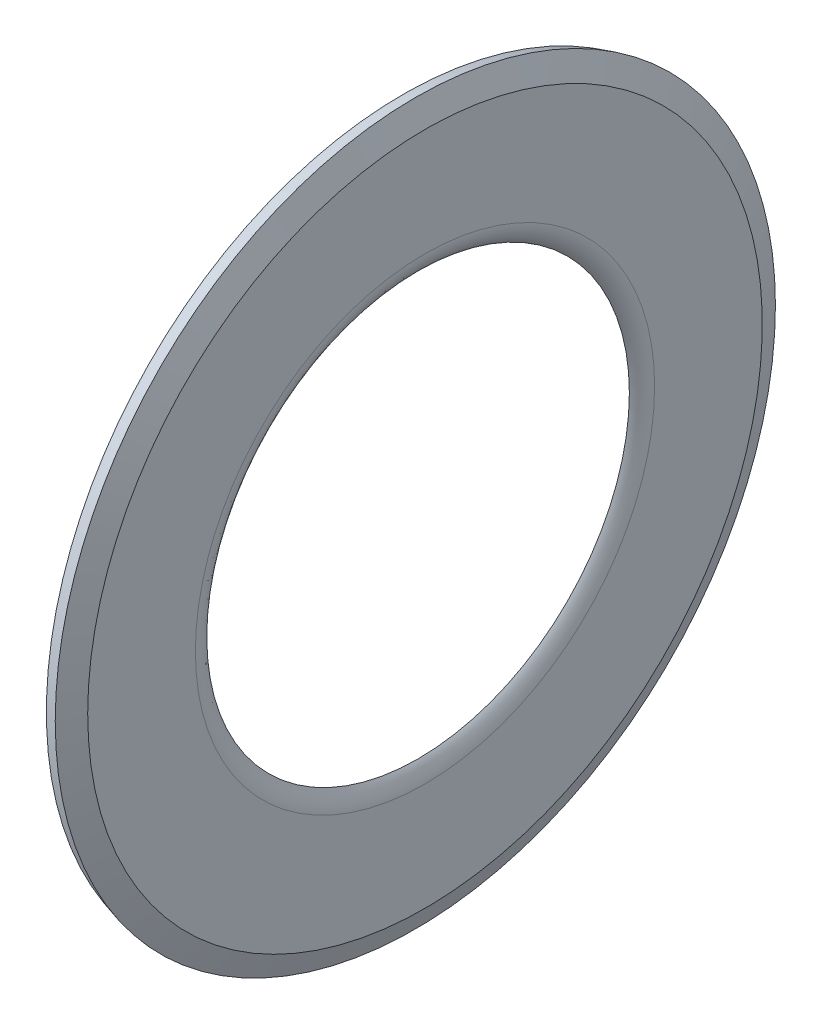
ISO-10303-21;
HEADER;
FILE_DESCRIPTION(('STEP AP214'),'2;1');
FILE_NAME('part.step','',(''),(''),'','','');
FILE_SCHEMA(('AUTOMOTIVE_DESIGN { 1 0 10303 214 1 1 1 1 }'));
ENDSEC;
DATA;
#1=APPLICATION_CONTEXT('core data for automotive mechanical design processes');
#2=APPLICATION_PROTOCOL_DEFINITION('international standard','automotive_design',2000,#1);
#3=PRODUCT_CONTEXT('',#1,'mechanical');
#4=PRODUCT('Part','Part','',(#3));
#5=PRODUCT_RELATED_PRODUCT_CATEGORY('part','',(#4));
#6=PRODUCT_DEFINITION_FORMATION('','',#4);
#7=PRODUCT_DEFINITION_CONTEXT('part definition',#1,'design');
#8=PRODUCT_DEFINITION('design','',#6,#7);
#9=PRODUCT_DEFINITION_SHAPE('','',#8);
#10=(LENGTH_UNIT() NAMED_UNIT(*) SI_UNIT(.MILLI.,.METRE.));
#11=(NAMED_UNIT(*) PLANE_ANGLE_UNIT() SI_UNIT($,.RADIAN.));
#12=(NAMED_UNIT(*) SI_UNIT($,.STERADIAN.) SOLID_ANGLE_UNIT());
#13=UNCERTAINTY_MEASURE_WITH_UNIT(LENGTH_MEASURE(1.E-05),#10,'distance_accuracy_value','');
#14=(GEOMETRIC_REPRESENTATION_CONTEXT(3) GLOBAL_UNCERTAINTY_ASSIGNED_CONTEXT((#13)) GLOBAL_UNIT_ASSIGNED_CONTEXT((#10,
#11,#12)) REPRESENTATION_CONTEXT('',''));
#15=CARTESIAN_POINT('',(0.,0.,0.));
#16=DIRECTION('',(0.,0.,1.));
#17=DIRECTION('',(1.,0.,0.));
#18=AXIS2_PLACEMENT_3D('',#15,#16,#17);
#19=CARTESIAN_POINT('',(0.228,6.16567962003259,0.));
#20=DIRECTION('',(-1.,0.,0.));
#21=DIRECTION('',(0.,-1.,0.));
#22=AXIS2_PLACEMENT_3D('',#19,#20,#21);
#23=PLANE('',#22);
#24=CARTESIAN_POINT('',(0.227999999937283,0.,0.));
#25=DIRECTION('',(1.,0.,0.));
#26=DIRECTION('',(0.,0.,-1.));
#27=AXIS2_PLACEMENT_3D('',#24,#25,#26);
#28=CIRCLE('',#27,5.63899999997375);
#29=CARTESIAN_POINT('',(0.227999999937283,0.,-5.63899999997375));
#30=VERTEX_POINT('',#29);
#31=EDGE_CURVE('E19',#30,#30,#28,.F.);
#32=ORIENTED_EDGE('',*,*,#31,.F.);
#33=EDGE_LOOP('',(#32));
#34=FACE_BOUND('',#33,.T.);
#35=CARTESIAN_POINT('',(0.228000000021211,0.,0.));
#36=DIRECTION('',(-1.,0.,0.));
#37=DIRECTION('',(0.,0.,1.));
#38=AXIS2_PLACEMENT_3D('',#35,#36,#37);
#39=CIRCLE('',#38,6.69235924004852);
#40=CARTESIAN_POINT('',(0.228000000021211,0.,6.69235924004852));
#41=VERTEX_POINT('',#40);
#42=EDGE_CURVE('E50',#41,#41,#39,.T.);
#43=ORIENTED_EDGE('',*,*,#42,.T.);
#44=EDGE_LOOP('',(#43));
#45=FACE_BOUND('',#44,.T.);
#46=ADVANCED_FACE('F16',(#34,#45),#23,.T.);
#47=CARTESIAN_POINT('',(0.227999999822259,0.,0.));
#48=DIRECTION('',(1.,0.,0.));
#49=DIRECTION('',(0.,0.,-1.));
#50=AXIS2_PLACEMENT_3D('',#47,#48,#49);
#51=CONICAL_SURFACE('',#50,5.63899999980322,0.97738438129997);
#52=ORIENTED_EDGE('',*,*,#31,.T.);
#53=EDGE_LOOP('',(#52));
#54=FACE_BOUND('',#53,.T.);
#55=CARTESIAN_POINT('',(0.119999999982583,0.,0.));
#56=DIRECTION('',(1.,0.,0.));
#57=DIRECTION('',(0.,0.,-1.));
#58=AXIS2_PLACEMENT_3D('',#55,#56,#57);
#59=CIRCLE('',#58,5.47888341537828);
#60=CARTESIAN_POINT('',(0.119999999982583,0.,-5.47888341537828));
#61=VERTEX_POINT('',#60);
#62=EDGE_CURVE('E48',#61,#61,#59,.F.);
#63=ORIENTED_EDGE('',*,*,#62,.F.);
#64=EDGE_LOOP('',(#63));
#65=FACE_BOUND('',#64,.T.);
#66=ADVANCED_FACE('F57',(#54,#65),#51,.T.);
#67=CARTESIAN_POINT('',(0.120000000009668,0.,0.));
#68=DIRECTION('',(-1.,0.,0.));
#69=DIRECTION('',(0.,0.,1.));
#70=AXIS2_PLACEMENT_3D('',#67,#68,#69);
#71=CONICAL_SURFACE('',#70,7.06900000000132,1.29154364646014);
#72=CARTESIAN_POINT('',(0.120000000009668,0.,0.));
#73=DIRECTION('',(-1.,0.,0.));
#74=DIRECTION('',(0.,0.,1.));
#75=AXIS2_PLACEMENT_3D('',#72,#73,#74);
#76=CIRCLE('',#75,7.06900000000132);
#77=CARTESIAN_POINT('',(0.120000000009668,0.,7.06900000000132));
#78=VERTEX_POINT('',#77);
#79=EDGE_CURVE('E45',#78,#78,#76,.F.);
#80=ORIENTED_EDGE('',*,*,#79,.F.);
#81=EDGE_LOOP('',(#80));
#82=FACE_BOUND('',#81,.T.);
#83=ORIENTED_EDGE('',*,*,#42,.F.);
#84=EDGE_LOOP('',(#83));
#85=FACE_BOUND('',#84,.T.);
#86=ADVANCED_FACE('F65',(#82,#85),#71,.F.);
#87=CARTESIAN_POINT('',(0.12,5.36394170770031,0.));
#88=DIRECTION('',(-1.,0.,0.));
#89=DIRECTION('',(0.,0.,1.));
#90=AXIS2_PLACEMENT_3D('',#87,#88,#89);
#91=PLANE('',#90);
#92=CARTESIAN_POINT('',(0.119999999981246,0.,0.));
#93=DIRECTION('',(-1.,0.,0.));
#94=DIRECTION('',(0.,0.,1.));
#95=AXIS2_PLACEMENT_3D('',#92,#93,#94);
#96=CIRCLE('',#95,5.24900000002049);
#97=CARTESIAN_POINT('',(0.119999999981246,0.,5.24900000002049));
#98=VERTEX_POINT('',#97);
#99=EDGE_CURVE('E42',#98,#98,#96,.F.);
#100=ORIENTED_EDGE('',*,*,#99,.T.);
#101=EDGE_LOOP('',(#100));
#102=FACE_BOUND('',#101,.T.);
#103=ORIENTED_EDGE('',*,*,#62,.T.);
#104=EDGE_LOOP('',(#103));
#105=FACE_BOUND('',#104,.T.);
#106=ADVANCED_FACE('F126',(#102,#105),#91,.T.);
#107=CARTESIAN_POINT('',(0.12,7.40795472314553,0.));
#108=DIRECTION('',(-1.,0.,0.));
#109=DIRECTION('',(0.,-1.,0.));
#110=AXIS2_PLACEMENT_3D('',#107,#108,#109);
#111=PLANE('',#110);
#112=ORIENTED_EDGE('',*,*,#79,.T.);
#113=EDGE_LOOP('',(#112));
#114=FACE_BOUND('',#113,.T.);
#115=CARTESIAN_POINT('',(0.120000000000002,0.,0.));
#116=DIRECTION('',(1.,0.,0.));
#117=DIRECTION('',(0.,0.,-1.));
#118=AXIS2_PLACEMENT_3D('',#115,#116,#117);
#119=CIRCLE('',#118,7.74690944629105);
#120=CARTESIAN_POINT('',(0.120000000000002,0.,-7.74690944629105));
#121=VERTEX_POINT('',#120);
#122=EDGE_CURVE('E39',#121,#121,#119,.T.);
#123=ORIENTED_EDGE('',*,*,#122,.F.);
#124=EDGE_LOOP('',(#123));
#125=FACE_BOUND('',#124,.T.);
#126=ADVANCED_FACE('F122',(#114,#125),#111,.T.);
#127=CARTESIAN_POINT('',(0.119999999981246,0.,0.));
#128=DIRECTION('',(-1.,0.,0.));
#129=DIRECTION('',(0.,0.,1.));
#130=AXIS2_PLACEMENT_3D('',#127,#128,#129);
#131=CONICAL_SURFACE('',#130,5.24900000002049,0.436332312858445);
#132=ORIENTED_EDGE('',*,*,#99,.F.);
#133=EDGE_LOOP('',(#132));
#134=FACE_BOUND('',#133,.T.);
#135=CARTESIAN_POINT('',(0.22799999999279,0.,0.));
#136=DIRECTION('',(-1.,0.,0.));
#137=DIRECTION('',(0.,1.,0.));
#138=AXIS2_PLACEMENT_3D('',#135,#136,#137);
#139=CIRCLE('',#138,5.19863877292437);
#140=CARTESIAN_POINT('',(0.22799999999279,5.19863877292437,0.));
#141=VERTEX_POINT('',#140);
#142=EDGE_CURVE('E37',#141,#141,#139,.F.);
#143=ORIENTED_EDGE('',*,*,#142,.T.);
#144=EDGE_LOOP('',(#143));
#145=FACE_BOUND('',#144,.T.);
#146=ADVANCED_FACE('F104',(#134,#145),#131,.F.);
#147=CARTESIAN_POINT('',(0.389772306011164,0.,0.));
#148=DIRECTION('',(1.,0.,0.));
#149=DIRECTION('',(0.,0.,-1.));
#150=AXIS2_PLACEMENT_3D('',#147,#148,#149);
#151=CONICAL_SURFACE('',#150,7.82426541024527,0.279252680319087);
#152=CARTESIAN_POINT('',(0.389772306011166,0.,0.));
#153=DIRECTION('',(-1.,0.,0.));
#154=DIRECTION('',(0.,1.,0.));
#155=AXIS2_PLACEMENT_3D('',#152,#153,#154);
#156=CIRCLE('',#155,7.82426541024527);
#157=CARTESIAN_POINT('',(0.389772306011166,7.82426541024527,0.));
#158=VERTEX_POINT('',#157);
#159=EDGE_CURVE('E33',#158,#158,#156,.F.);
#160=ORIENTED_EDGE('',*,*,#159,.F.);
#161=EDGE_LOOP('',(#160));
#162=FACE_BOUND('',#161,.T.);
#163=ORIENTED_EDGE('',*,*,#122,.T.);
#164=EDGE_LOOP('',(#163));
#165=FACE_BOUND('',#164,.T.);
#166=ADVANCED_FACE('F109',(#162,#165),#151,.T.);
#167=CARTESIAN_POINT('',(0.22799999999279,0.,0.));
#168=DIRECTION('',(-1.,0.,0.));
#169=DIRECTION('',(0.,0.,1.));
#170=AXIS2_PLACEMENT_3D('',#167,#168,#169);
#171=CONICAL_SURFACE('',#170,5.19863877292437,1.22173047634779);
#172=ORIENTED_EDGE('',*,*,#142,.F.);
#173=EDGE_LOOP('',(#172));
#174=FACE_BOUND('',#173,.T.);
#175=CARTESIAN_POINT('',(0.449113515553936,0.,0.));
#176=DIRECTION('',(-1.,0.,0.));
#177=DIRECTION('',(0.,0.,1.));
#178=AXIS2_PLACEMENT_3D('',#175,#176,#177);
#179=CIRCLE('',#178,4.5911343817986);
#180=CARTESIAN_POINT('',(0.449113515553936,0.,4.5911343817986));
#181=VERTEX_POINT('',#180);
#182=EDGE_CURVE('E28',#181,#181,#179,.T.);
#183=ORIENTED_EDGE('',*,*,#182,.F.);
#184=EDGE_LOOP('',(#183));
#185=FACE_BOUND('',#184,.T.);
#186=ADVANCED_FACE('F106',(#174,#185),#171,.F.);
#187=CARTESIAN_POINT('',(0.389772306011166,0.,0.));
#188=DIRECTION('',(-1.,0.,0.));
#189=DIRECTION('',(0.,0.,1.));
#190=AXIS2_PLACEMENT_3D('',#187,#188,#189);
#191=CONICAL_SURFACE('',#190,7.82426541024527,1.1693705988362);
#192=CARTESIAN_POINT('',(0.600000000000003,0.,0.));
#193=DIRECTION('',(-1.,0.,0.));
#194=DIRECTION('',(0.,0.,1.));
#195=AXIS2_PLACEMENT_3D('',#192,#193,#194);
#196=CIRCLE('',#195,7.329);
#197=CARTESIAN_POINT('',(0.600000000000003,0.,7.329));
#198=VERTEX_POINT('',#197);
#199=EDGE_CURVE('E23',#198,#198,#196,.F.);
#200=ORIENTED_EDGE('',*,*,#199,.F.);
#201=EDGE_LOOP('',(#200));
#202=FACE_BOUND('',#201,.T.);
#203=ORIENTED_EDGE('',*,*,#159,.T.);
#204=EDGE_LOOP('',(#203));
#205=FACE_BOUND('',#204,.T.);
#206=ADVANCED_FACE('F72',(#202,#205),#191,.T.);
#207=CARTESIAN_POINT('',(0.,0.,0.));
#208=DIRECTION('',(-1.,0.,0.));
#209=DIRECTION('',(0.,0.,1.));
#210=AXIS2_PLACEMENT_3D('',#207,#208,#209);
#211=TOROIDAL_SURFACE('',#210,4.989,0.599999999999998);
#212=ORIENTED_EDGE('',*,*,#182,.T.);
#213=EDGE_LOOP('',(#212));
#214=FACE_BOUND('',#213,.T.);
#215=CARTESIAN_POINT('',(0.6,0.,0.));
#216=DIRECTION('',(1.,0.,0.));
#217=DIRECTION('',(0.,0.,-1.));
#218=AXIS2_PLACEMENT_3D('',#215,#216,#217);
#219=CIRCLE('',#218,4.989);
#220=CARTESIAN_POINT('',(0.6,0.,-4.989));
#221=VERTEX_POINT('',#220);
#222=EDGE_CURVE('E10',#221,#221,#219,.F.);
#223=ORIENTED_EDGE('',*,*,#222,.F.);
#224=EDGE_LOOP('',(#223));
#225=FACE_BOUND('',#224,.T.);
#226=ADVANCED_FACE('F68',(#214,#225),#211,.T.);
#227=CARTESIAN_POINT('',(0.6,6.159,0.));
#228=DIRECTION('',(1.,0.,0.));
#229=DIRECTION('',(0.,1.,0.));
#230=AXIS2_PLACEMENT_3D('',#227,#228,#229);
#231=PLANE('',#230);
#232=ORIENTED_EDGE('',*,*,#222,.T.);
#233=EDGE_LOOP('',(#232));
#234=FACE_BOUND('',#233,.T.);
#235=ORIENTED_EDGE('',*,*,#199,.T.);
#236=EDGE_LOOP('',(#235));
#237=FACE_BOUND('',#236,.T.);
#238=ADVANCED_FACE('F66',(#234,#237),#231,.T.);
#239=CLOSED_SHELL('',(#46,#66,#86,#106,#126,#146,#166,#186,#206,#226,#238));
#240=MANIFOLD_SOLID_BREP('B1',#239);
#241=ADVANCED_BREP_SHAPE_REPRESENTATION('',(#18,#240),#14);
#242=SHAPE_DEFINITION_REPRESENTATION(#9,#241);
ENDSEC;
END-ISO-10303-21;
